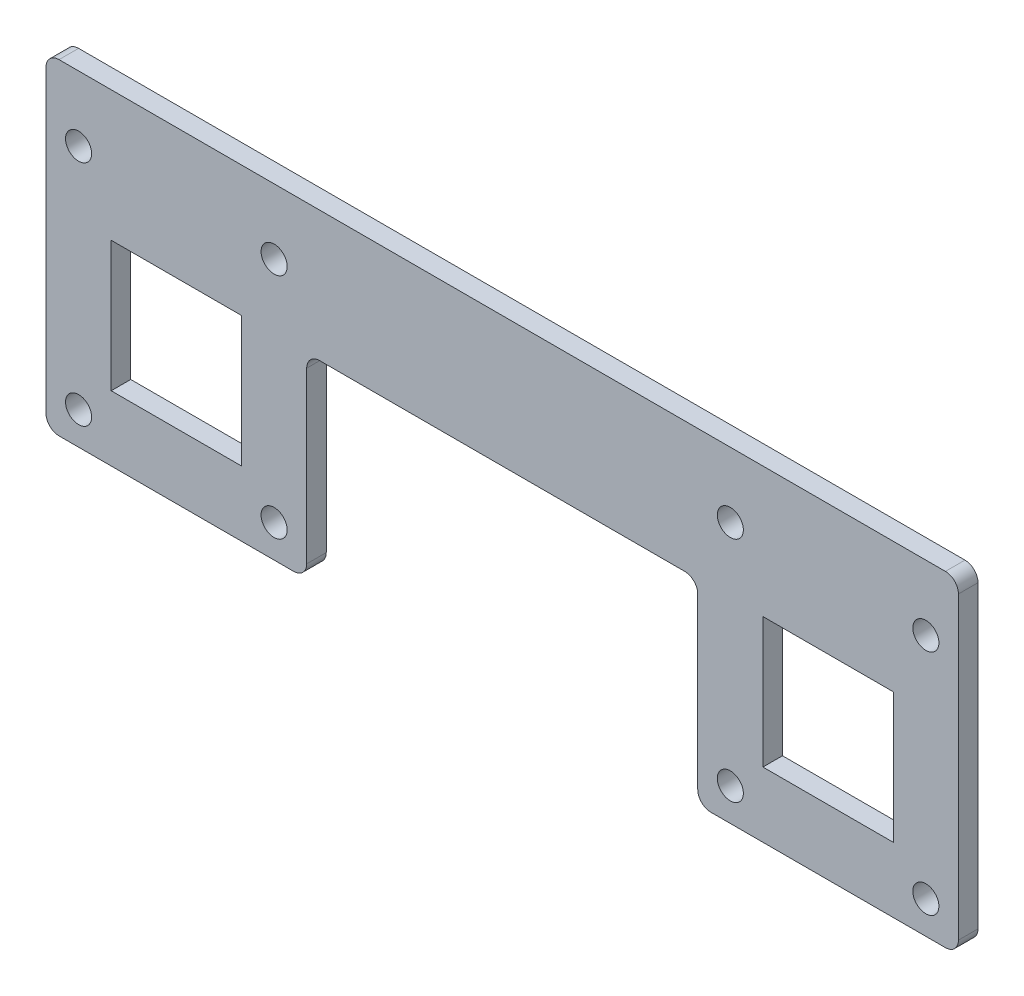
ISO-10303-21;
HEADER;
FILE_DESCRIPTION(('STEP AP214'),'2;1');
FILE_NAME('part.step','',(''),(''),'','','');
FILE_SCHEMA(('AUTOMOTIVE_DESIGN { 1 0 10303 214 1 1 1 1 }'));
ENDSEC;
DATA;
#1=APPLICATION_CONTEXT('core data for automotive mechanical design processes');
#2=APPLICATION_PROTOCOL_DEFINITION('international standard','automotive_design',2000,#1);
#3=PRODUCT_CONTEXT('',#1,'mechanical');
#4=PRODUCT('Part','Part','',(#3));
#5=PRODUCT_RELATED_PRODUCT_CATEGORY('part','',(#4));
#6=PRODUCT_DEFINITION_FORMATION('','',#4);
#7=PRODUCT_DEFINITION_CONTEXT('part definition',#1,'design');
#8=PRODUCT_DEFINITION('design','',#6,#7);
#9=PRODUCT_DEFINITION_SHAPE('','',#8);
#10=(LENGTH_UNIT() NAMED_UNIT(*) SI_UNIT(.MILLI.,.METRE.));
#11=(NAMED_UNIT(*) PLANE_ANGLE_UNIT() SI_UNIT($,.RADIAN.));
#12=(NAMED_UNIT(*) SI_UNIT($,.STERADIAN.) SOLID_ANGLE_UNIT());
#13=UNCERTAINTY_MEASURE_WITH_UNIT(LENGTH_MEASURE(1.E-05),#10,'distance_accuracy_value','');
#14=(GEOMETRIC_REPRESENTATION_CONTEXT(3) GLOBAL_UNCERTAINTY_ASSIGNED_CONTEXT((#13)) GLOBAL_UNIT_ASSIGNED_CONTEXT((#10,
#11,#12)) REPRESENTATION_CONTEXT('',''));
#15=CARTESIAN_POINT('',(0.,0.,0.));
#16=DIRECTION('',(0.,0.,1.));
#17=DIRECTION('',(1.,0.,0.));
#18=AXIS2_PLACEMENT_3D('',#15,#16,#17);
#19=CARTESIAN_POINT('',(-70.,-25.,3.));
#20=DIRECTION('',(0.,1.,0.));
#21=DIRECTION('',(0.,0.,1.));
#22=AXIS2_PLACEMENT_3D('',#19,#20,#21);
#23=PLANE('',#22);
#24=DIRECTION('',(1.,0.,0.));
#25=VECTOR('',#24,1.);
#26=CARTESIAN_POINT('',(-70.,-25.,0.));
#27=LINE('',#26,#25);
#28=CARTESIAN_POINT('',(32.,-25.,0.));
#29=VERTEX_POINT('',#28);
#30=CARTESIAN_POINT('',(68.,-25.,0.));
#31=VERTEX_POINT('',#30);
#32=EDGE_CURVE('E335',#29,#31,#27,.T.);
#33=ORIENTED_EDGE('',*,*,#32,.T.);
#34=DIRECTION('',(0.,0.,-1.));
#35=VECTOR('',#34,1.);
#36=CARTESIAN_POINT('',(68.,-25.,3.));
#37=LINE('',#36,#35);
#38=CARTESIAN_POINT('',(68.,-25.,3.));
#39=VERTEX_POINT('',#38);
#40=EDGE_CURVE('E391',#31,#39,#37,.F.);
#41=ORIENTED_EDGE('',*,*,#40,.T.);
#42=DIRECTION('',(1.,0.,0.));
#43=VECTOR('',#42,1.);
#44=CARTESIAN_POINT('',(-70.,-25.,3.));
#45=LINE('',#44,#43);
#46=CARTESIAN_POINT('',(32.,-25.,3.));
#47=VERTEX_POINT('',#46);
#48=EDGE_CURVE('E318',#47,#39,#45,.T.);
#49=ORIENTED_EDGE('',*,*,#48,.F.);
#50=DIRECTION('',(0.,0.,1.));
#51=VECTOR('',#50,1.);
#52=CARTESIAN_POINT('',(32.,-25.,3.));
#53=LINE('',#52,#51);
#54=EDGE_CURVE('E388',#47,#29,#53,.F.);
#55=ORIENTED_EDGE('',*,*,#54,.T.);
#56=EDGE_LOOP('',(#33,#41,#49,#55));
#57=FACE_BOUND('',#56,.T.);
#58=ADVANCED_FACE('F39',(#57),#23,.F.);
#59=CARTESIAN_POINT('',(70.,25.,3.));
#60=DIRECTION('',(-1.,0.,0.));
#61=DIRECTION('',(0.,0.,1.));
#62=AXIS2_PLACEMENT_3D('',#59,#60,#61);
#63=PLANE('',#62);
#64=DIRECTION('',(0.,1.,0.));
#65=VECTOR('',#64,1.);
#66=CARTESIAN_POINT('',(70.,25.,0.));
#67=LINE('',#66,#65);
#68=CARTESIAN_POINT('',(70.,-23.,0.));
#69=VERTEX_POINT('',#68);
#70=CARTESIAN_POINT('',(70.,23.,0.));
#71=VERTEX_POINT('',#70);
#72=EDGE_CURVE('E255',#69,#71,#67,.T.);
#73=ORIENTED_EDGE('',*,*,#72,.T.);
#74=DIRECTION('',(0.,0.,-1.));
#75=VECTOR('',#74,1.);
#76=CARTESIAN_POINT('',(70.,23.,3.));
#77=LINE('',#76,#75);
#78=CARTESIAN_POINT('',(70.,23.,3.));
#79=VERTEX_POINT('',#78);
#80=EDGE_CURVE('E367',#71,#79,#77,.F.);
#81=ORIENTED_EDGE('',*,*,#80,.T.);
#82=DIRECTION('',(0.,1.,0.));
#83=VECTOR('',#82,1.);
#84=CARTESIAN_POINT('',(70.,25.,3.));
#85=LINE('',#84,#83);
#86=CARTESIAN_POINT('',(70.,-23.,3.));
#87=VERTEX_POINT('',#86);
#88=EDGE_CURVE('E305',#87,#79,#85,.T.);
#89=ORIENTED_EDGE('',*,*,#88,.F.);
#90=DIRECTION('',(0.,0.,-1.));
#91=VECTOR('',#90,1.);
#92=CARTESIAN_POINT('',(70.,-23.,3.));
#93=LINE('',#92,#91);
#94=EDGE_CURVE('E363',#87,#69,#93,.T.);
#95=ORIENTED_EDGE('',*,*,#94,.T.);
#96=EDGE_LOOP('',(#73,#81,#89,#95));
#97=FACE_BOUND('',#96,.T.);
#98=ADVANCED_FACE('F454',(#97),#63,.F.);
#99=CARTESIAN_POINT('',(-70.,25.,3.));
#100=DIRECTION('',(0.,-1.,0.));
#101=DIRECTION('',(0.,0.,-1.));
#102=AXIS2_PLACEMENT_3D('',#99,#100,#101);
#103=PLANE('',#102);
#104=DIRECTION('',(-1.,0.,0.));
#105=VECTOR('',#104,1.);
#106=CARTESIAN_POINT('',(-70.,25.,3.));
#107=LINE('',#106,#105);
#108=CARTESIAN_POINT('',(68.,25.,3.));
#109=VERTEX_POINT('',#108);
#110=CARTESIAN_POINT('',(-68.,25.,3.));
#111=VERTEX_POINT('',#110);
#112=EDGE_CURVE('E309',#109,#111,#107,.T.);
#113=ORIENTED_EDGE('',*,*,#112,.F.);
#114=DIRECTION('',(0.,0.,-1.));
#115=VECTOR('',#114,1.);
#116=CARTESIAN_POINT('',(68.,25.,3.));
#117=LINE('',#116,#115);
#118=CARTESIAN_POINT('',(68.,25.,0.));
#119=VERTEX_POINT('',#118);
#120=EDGE_CURVE('E341',#109,#119,#117,.T.);
#121=ORIENTED_EDGE('',*,*,#120,.T.);
#122=DIRECTION('',(-1.,0.,0.));
#123=VECTOR('',#122,1.);
#124=CARTESIAN_POINT('',(-70.,25.,0.));
#125=LINE('',#124,#123);
#126=CARTESIAN_POINT('',(-68.,25.,0.));
#127=VERTEX_POINT('',#126);
#128=EDGE_CURVE('E327',#119,#127,#125,.T.);
#129=ORIENTED_EDGE('',*,*,#128,.T.);
#130=DIRECTION('',(0.,0.,-1.));
#131=VECTOR('',#130,1.);
#132=CARTESIAN_POINT('',(-68.,25.,3.));
#133=LINE('',#132,#131);
#134=EDGE_CURVE('E323',#127,#111,#133,.F.);
#135=ORIENTED_EDGE('',*,*,#134,.T.);
#136=EDGE_LOOP('',(#113,#121,#129,#135));
#137=FACE_BOUND('',#136,.T.);
#138=ADVANCED_FACE('F463',(#137),#103,.F.);
#139=CARTESIAN_POINT('',(-70.,25.,3.));
#140=DIRECTION('',(1.,0.,0.));
#141=DIRECTION('',(0.,1.,0.));
#142=AXIS2_PLACEMENT_3D('',#139,#140,#141);
#143=PLANE('',#142);
#144=DIRECTION('',(0.,-1.,0.));
#145=VECTOR('',#144,1.);
#146=CARTESIAN_POINT('',(-70.,25.,0.));
#147=LINE('',#146,#145);
#148=CARTESIAN_POINT('',(-70.,23.,0.));
#149=VERTEX_POINT('',#148);
#150=CARTESIAN_POINT('',(-70.,-23.,0.));
#151=VERTEX_POINT('',#150);
#152=EDGE_CURVE('E331',#149,#151,#147,.T.);
#153=ORIENTED_EDGE('',*,*,#152,.T.);
#154=DIRECTION('',(0.,0.,-1.));
#155=VECTOR('',#154,1.);
#156=CARTESIAN_POINT('',(-70.,-23.,3.));
#157=LINE('',#156,#155);
#158=CARTESIAN_POINT('',(-70.,-23.,3.));
#159=VERTEX_POINT('',#158);
#160=EDGE_CURVE('E426',#151,#159,#157,.F.);
#161=ORIENTED_EDGE('',*,*,#160,.T.);
#162=DIRECTION('',(0.,-1.,0.));
#163=VECTOR('',#162,1.);
#164=CARTESIAN_POINT('',(-70.,25.,3.));
#165=LINE('',#164,#163);
#166=CARTESIAN_POINT('',(-70.,23.,3.));
#167=VERTEX_POINT('',#166);
#168=EDGE_CURVE('E314',#167,#159,#165,.T.);
#169=ORIENTED_EDGE('',*,*,#168,.F.);
#170=DIRECTION('',(0.,0.,-1.));
#171=VECTOR('',#170,1.);
#172=CARTESIAN_POINT('',(-70.,23.,3.));
#173=LINE('',#172,#171);
#174=EDGE_CURVE('E422',#167,#149,#173,.T.);
#175=ORIENTED_EDGE('',*,*,#174,.T.);
#176=EDGE_LOOP('',(#153,#161,#169,#175));
#177=FACE_BOUND('',#176,.T.);
#178=ADVANCED_FACE('F471',(#177),#143,.F.);
#179=CARTESIAN_POINT('',(-68.,-25.,0.));
#180=VERTEX_POINT('',#179);
#181=CARTESIAN_POINT('',(-32.,-25.,0.));
#182=VERTEX_POINT('',#181);
#183=EDGE_CURVE('E310',#180,#182,#27,.T.);
#184=ORIENTED_EDGE('',*,*,#183,.T.);
#185=DIRECTION('',(0.,0.,1.));
#186=VECTOR('',#185,1.);
#187=CARTESIAN_POINT('',(-32.,-25.,3.));
#188=LINE('',#187,#186);
#189=CARTESIAN_POINT('',(-32.,-25.,3.));
#190=VERTEX_POINT('',#189);
#191=EDGE_CURVE('E418',#182,#190,#188,.T.);
#192=ORIENTED_EDGE('',*,*,#191,.T.);
#193=CARTESIAN_POINT('',(-68.,-25.,3.));
#194=VERTEX_POINT('',#193);
#195=EDGE_CURVE('E319',#194,#190,#45,.T.);
#196=ORIENTED_EDGE('',*,*,#195,.F.);
#197=DIRECTION('',(0.,0.,-1.));
#198=VECTOR('',#197,1.);
#199=CARTESIAN_POINT('',(-68.,-25.,3.));
#200=LINE('',#199,#198);
#201=EDGE_CURVE('E414',#194,#180,#200,.T.);
#202=ORIENTED_EDGE('',*,*,#201,.T.);
#203=EDGE_LOOP('',(#184,#192,#196,#202));
#204=FACE_BOUND('',#203,.T.);
#205=ADVANCED_FACE('F479',(#204),#23,.F.);
#206=CARTESIAN_POINT('',(0.,0.,3.));
#207=DIRECTION('',(0.,0.,1.));
#208=DIRECTION('',(1.,0.,0.));
#209=AXIS2_PLACEMENT_3D('',#206,#207,#208);
#210=PLANE('',#209);
#211=CARTESIAN_POINT('',(-65.,15.,3.));
#212=DIRECTION('',(0.,0.,1.));
#213=DIRECTION('',(1.,0.,0.));
#214=AXIS2_PLACEMENT_3D('',#211,#212,#213);
#215=CIRCLE('',#214,2.);
#216=CARTESIAN_POINT('',(-63.,15.,3.));
#217=VERTEX_POINT('',#216);
#218=EDGE_CURVE('E569',#217,#217,#215,.T.);
#219=ORIENTED_EDGE('',*,*,#218,.F.);
#220=EDGE_LOOP('',(#219));
#221=FACE_BOUND('',#220,.T.);
#222=CARTESIAN_POINT('',(-35.,15.,3.));
#223=DIRECTION('',(0.,0.,1.));
#224=DIRECTION('',(1.,0.,0.));
#225=AXIS2_PLACEMENT_3D('',#222,#223,#224);
#226=CIRCLE('',#225,2.);
#227=CARTESIAN_POINT('',(-33.,15.,3.));
#228=VERTEX_POINT('',#227);
#229=EDGE_CURVE('E561',#228,#228,#226,.T.);
#230=ORIENTED_EDGE('',*,*,#229,.F.);
#231=EDGE_LOOP('',(#230));
#232=FACE_BOUND('',#231,.T.);
#233=CARTESIAN_POINT('',(35.,15.,3.));
#234=DIRECTION('',(0.,0.,1.));
#235=DIRECTION('',(-1.,0.,0.));
#236=AXIS2_PLACEMENT_3D('',#233,#234,#235);
#237=CIRCLE('',#236,2.);
#238=CARTESIAN_POINT('',(33.,15.,3.));
#239=VERTEX_POINT('',#238);
#240=EDGE_CURVE('E553',#239,#239,#237,.T.);
#241=ORIENTED_EDGE('',*,*,#240,.F.);
#242=EDGE_LOOP('',(#241));
#243=FACE_BOUND('',#242,.T.);
#244=CARTESIAN_POINT('',(65.,15.,3.));
#245=DIRECTION('',(0.,0.,1.));
#246=DIRECTION('',(-1.,0.,0.));
#247=AXIS2_PLACEMENT_3D('',#244,#245,#246);
#248=CIRCLE('',#247,2.);
#249=CARTESIAN_POINT('',(63.,15.,3.));
#250=VERTEX_POINT('',#249);
#251=EDGE_CURVE('E545',#250,#250,#248,.T.);
#252=ORIENTED_EDGE('',*,*,#251,.F.);
#253=EDGE_LOOP('',(#252));
#254=FACE_BOUND('',#253,.T.);
#255=CARTESIAN_POINT('',(-65.,-20.,3.));
#256=DIRECTION('',(0.,0.,1.));
#257=DIRECTION('',(1.,0.,0.));
#258=AXIS2_PLACEMENT_3D('',#255,#256,#257);
#259=CIRCLE('',#258,2.);
#260=CARTESIAN_POINT('',(-63.,-20.,3.));
#261=VERTEX_POINT('',#260);
#262=EDGE_CURVE('E530',#261,#261,#259,.T.);
#263=ORIENTED_EDGE('',*,*,#262,.F.);
#264=EDGE_LOOP('',(#263));
#265=FACE_BOUND('',#264,.T.);
#266=CARTESIAN_POINT('',(35.,-20.,3.));
#267=DIRECTION('',(0.,0.,1.));
#268=DIRECTION('',(-1.,0.,0.));
#269=AXIS2_PLACEMENT_3D('',#266,#267,#268);
#270=CIRCLE('',#269,2.);
#271=CARTESIAN_POINT('',(33.,-20.,3.));
#272=VERTEX_POINT('',#271);
#273=EDGE_CURVE('E531',#272,#272,#270,.T.);
#274=ORIENTED_EDGE('',*,*,#273,.F.);
#275=EDGE_LOOP('',(#274));
#276=FACE_BOUND('',#275,.T.);
#277=CARTESIAN_POINT('',(65.,-20.,3.));
#278=DIRECTION('',(0.,0.,1.));
#279=DIRECTION('',(-1.,0.,0.));
#280=AXIS2_PLACEMENT_3D('',#277,#278,#279);
#281=CIRCLE('',#280,2.);
#282=CARTESIAN_POINT('',(63.,-20.,3.));
#283=VERTEX_POINT('',#282);
#284=EDGE_CURVE('E513',#283,#283,#281,.T.);
#285=ORIENTED_EDGE('',*,*,#284,.F.);
#286=EDGE_LOOP('',(#285));
#287=FACE_BOUND('',#286,.T.);
#288=CARTESIAN_POINT('',(-35.,-20.,3.));
#289=DIRECTION('',(0.,0.,1.));
#290=DIRECTION('',(1.,0.,0.));
#291=AXIS2_PLACEMENT_3D('',#288,#289,#290);
#292=CIRCLE('',#291,2.);
#293=CARTESIAN_POINT('',(-33.,-20.,3.));
#294=VERTEX_POINT('',#293);
#295=EDGE_CURVE('E522',#294,#294,#292,.T.);
#296=ORIENTED_EDGE('',*,*,#295,.F.);
#297=EDGE_LOOP('',(#296));
#298=FACE_BOUND('',#297,.T.);
#299=ORIENTED_EDGE('',*,*,#88,.T.);
#300=CARTESIAN_POINT('',(68.,23.,3.));
#301=DIRECTION('',(0.,0.,1.));
#302=DIRECTION('',(1.,0.,0.));
#303=AXIS2_PLACEMENT_3D('',#300,#301,#302);
#304=CIRCLE('',#303,2.);
#305=EDGE_CURVE('E385',#79,#109,#304,.T.);
#306=ORIENTED_EDGE('',*,*,#305,.T.);
#307=ORIENTED_EDGE('',*,*,#112,.T.);
#308=CARTESIAN_POINT('',(-68.,23.,3.));
#309=DIRECTION('',(0.,0.,1.));
#310=DIRECTION('',(1.,0.,0.));
#311=AXIS2_PLACEMENT_3D('',#308,#309,#310);
#312=CIRCLE('',#311,2.);
#313=EDGE_CURVE('E370',#111,#167,#312,.T.);
#314=ORIENTED_EDGE('',*,*,#313,.T.);
#315=ORIENTED_EDGE('',*,*,#168,.T.);
#316=CARTESIAN_POINT('',(-68.,-23.,3.));
#317=DIRECTION('',(0.,0.,1.));
#318=DIRECTION('',(1.,0.,0.));
#319=AXIS2_PLACEMENT_3D('',#316,#317,#318);
#320=CIRCLE('',#319,2.);
#321=EDGE_CURVE('E373',#159,#194,#320,.T.);
#322=ORIENTED_EDGE('',*,*,#321,.T.);
#323=ORIENTED_EDGE('',*,*,#195,.T.);
#324=CARTESIAN_POINT('',(-32.,-23.,3.));
#325=DIRECTION('',(0.,0.,1.));
#326=DIRECTION('',(1.,0.,0.));
#327=AXIS2_PLACEMENT_3D('',#324,#325,#326);
#328=CIRCLE('',#327,2.);
#329=CARTESIAN_POINT('',(-30.,-23.,3.));
#330=VERTEX_POINT('',#329);
#331=EDGE_CURVE('E376',#190,#330,#328,.T.);
#332=ORIENTED_EDGE('',*,*,#331,.T.);
#333=DIRECTION('',(0.,-1.,0.));
#334=VECTOR('',#333,1.);
#335=CARTESIAN_POINT('',(-30.,5.,3.));
#336=LINE('',#335,#334);
#337=CARTESIAN_POINT('',(-30.,3.,3.));
#338=VERTEX_POINT('',#337);
#339=EDGE_CURVE('E236',#338,#330,#336,.T.);
#340=ORIENTED_EDGE('',*,*,#339,.F.);
#341=CARTESIAN_POINT('',(-28.,3.,3.));
#342=DIRECTION('',(0.,0.,1.));
#343=DIRECTION('',(1.,0.,0.));
#344=AXIS2_PLACEMENT_3D('',#341,#342,#343);
#345=CIRCLE('',#344,2.);
#346=CARTESIAN_POINT('',(-28.,5.,3.));
#347=VERTEX_POINT('',#346);
#348=EDGE_CURVE('E48',#338,#347,#345,.F.);
#349=ORIENTED_EDGE('',*,*,#348,.T.);
#350=DIRECTION('',(-1.,0.,0.));
#351=VECTOR('',#350,1.);
#352=CARTESIAN_POINT('',(-30.,5.,3.));
#353=LINE('',#352,#351);
#354=CARTESIAN_POINT('',(28.,5.,3.));
#355=VERTEX_POINT('',#354);
#356=EDGE_CURVE('E494',#355,#347,#353,.T.);
#357=ORIENTED_EDGE('',*,*,#356,.F.);
#358=CARTESIAN_POINT('',(28.,3.,3.));
#359=DIRECTION('',(0.,0.,1.));
#360=DIRECTION('',(1.,0.,0.));
#361=AXIS2_PLACEMENT_3D('',#358,#359,#360);
#362=CIRCLE('',#361,2.);
#363=CARTESIAN_POINT('',(30.,3.,3.));
#364=VERTEX_POINT('',#363);
#365=EDGE_CURVE('E62',#355,#364,#362,.F.);
#366=ORIENTED_EDGE('',*,*,#365,.T.);
#367=DIRECTION('',(0.,1.,0.));
#368=VECTOR('',#367,1.);
#369=CARTESIAN_POINT('',(30.,5.,3.));
#370=LINE('',#369,#368);
#371=CARTESIAN_POINT('',(30.,-23.,3.));
#372=VERTEX_POINT('',#371);
#373=EDGE_CURVE('E500',#372,#364,#370,.T.);
#374=ORIENTED_EDGE('',*,*,#373,.F.);
#375=CARTESIAN_POINT('',(32.,-23.,3.));
#376=DIRECTION('',(0.,0.,1.));
#377=DIRECTION('',(1.,0.,0.));
#378=AXIS2_PLACEMENT_3D('',#375,#376,#377);
#379=CIRCLE('',#378,2.);
#380=EDGE_CURVE('E379',#372,#47,#379,.T.);
#381=ORIENTED_EDGE('',*,*,#380,.T.);
#382=ORIENTED_EDGE('',*,*,#48,.T.);
#383=CARTESIAN_POINT('',(68.,-23.,3.));
#384=DIRECTION('',(0.,0.,1.));
#385=DIRECTION('',(1.,0.,0.));
#386=AXIS2_PLACEMENT_3D('',#383,#384,#385);
#387=CIRCLE('',#386,2.);
#388=EDGE_CURVE('E382',#39,#87,#387,.T.);
#389=ORIENTED_EDGE('',*,*,#388,.T.);
#390=EDGE_LOOP('',(#299,#306,#307,#314,#315,#322,#323,#332,#340,#349,#357,#366,#374,#381,#382,#389));
#391=FACE_BOUND('',#390,.T.);
#392=DIRECTION('',(0.,1.,0.));
#393=VECTOR('',#392,1.);
#394=CARTESIAN_POINT('',(-40.,5.,3.));
#395=LINE('',#394,#393);
#396=CARTESIAN_POINT('',(-40.,-15.,3.));
#397=VERTEX_POINT('',#396);
#398=CARTESIAN_POINT('',(-40.,5.,3.));
#399=VERTEX_POINT('',#398);
#400=EDGE_CURVE('E208',#397,#399,#395,.T.);
#401=ORIENTED_EDGE('',*,*,#400,.F.);
#402=DIRECTION('',(1.,0.,0.));
#403=VECTOR('',#402,1.);
#404=CARTESIAN_POINT('',(-60.,-15.,3.));
#405=LINE('',#404,#403);
#406=CARTESIAN_POINT('',(-60.,-15.,3.));
#407=VERTEX_POINT('',#406);
#408=EDGE_CURVE('E229',#407,#397,#405,.T.);
#409=ORIENTED_EDGE('',*,*,#408,.F.);
#410=DIRECTION('',(0.,-1.,0.));
#411=VECTOR('',#410,1.);
#412=CARTESIAN_POINT('',(-60.,5.,3.));
#413=LINE('',#412,#411);
#414=CARTESIAN_POINT('',(-60.,5.,3.));
#415=VERTEX_POINT('',#414);
#416=EDGE_CURVE('E233',#415,#407,#413,.T.);
#417=ORIENTED_EDGE('',*,*,#416,.F.);
#418=DIRECTION('',(-1.,0.,0.));
#419=VECTOR('',#418,1.);
#420=CARTESIAN_POINT('',(-60.,5.,3.));
#421=LINE('',#420,#419);
#422=EDGE_CURVE('E245',#399,#415,#421,.T.);
#423=ORIENTED_EDGE('',*,*,#422,.F.);
#424=EDGE_LOOP('',(#401,#409,#417,#423));
#425=FACE_BOUND('',#424,.T.);
#426=DIRECTION('',(0.,1.,0.));
#427=VECTOR('',#426,1.);
#428=CARTESIAN_POINT('',(60.,5.,3.));
#429=LINE('',#428,#427);
#430=CARTESIAN_POINT('',(60.,-15.,3.));
#431=VERTEX_POINT('',#430);
#432=CARTESIAN_POINT('',(60.,5.,3.));
#433=VERTEX_POINT('',#432);
#434=EDGE_CURVE('E279',#431,#433,#429,.T.);
#435=ORIENTED_EDGE('',*,*,#434,.F.);
#436=DIRECTION('',(1.,0.,0.));
#437=VECTOR('',#436,1.);
#438=CARTESIAN_POINT('',(60.,-15.,3.));
#439=LINE('',#438,#437);
#440=CARTESIAN_POINT('',(40.,-15.,3.));
#441=VERTEX_POINT('',#440);
#442=EDGE_CURVE('E266',#441,#431,#439,.T.);
#443=ORIENTED_EDGE('',*,*,#442,.F.);
#444=DIRECTION('',(0.,-1.,0.));
#445=VECTOR('',#444,1.);
#446=CARTESIAN_POINT('',(40.,5.,3.));
#447=LINE('',#446,#445);
#448=CARTESIAN_POINT('',(40.,5.,3.));
#449=VERTEX_POINT('',#448);
#450=EDGE_CURVE('E287',#449,#441,#447,.T.);
#451=ORIENTED_EDGE('',*,*,#450,.F.);
#452=DIRECTION('',(-1.,0.,0.));
#453=VECTOR('',#452,1.);
#454=CARTESIAN_POINT('',(60.,5.,3.));
#455=LINE('',#454,#453);
#456=EDGE_CURVE('E282',#433,#449,#455,.T.);
#457=ORIENTED_EDGE('',*,*,#456,.F.);
#458=EDGE_LOOP('',(#435,#443,#451,#457));
#459=FACE_BOUND('',#458,.T.);
#460=ADVANCED_FACE('F450',(#221,#232,#243,#254,#265,#276,#287,#298,#391,#425,#459),#210,.T.);
#461=CARTESIAN_POINT('',(0.,0.,0.));
#462=DIRECTION('',(0.,0.,1.));
#463=DIRECTION('',(1.,0.,0.));
#464=AXIS2_PLACEMENT_3D('',#461,#462,#463);
#465=PLANE('',#464);
#466=CARTESIAN_POINT('',(-65.,15.,0.));
#467=DIRECTION('',(0.,0.,1.));
#468=DIRECTION('',(1.,0.,0.));
#469=AXIS2_PLACEMENT_3D('',#466,#467,#468);
#470=CIRCLE('',#469,2.);
#471=CARTESIAN_POINT('',(-63.,15.,0.));
#472=VERTEX_POINT('',#471);
#473=EDGE_CURVE('E535',#472,#472,#470,.T.);
#474=ORIENTED_EDGE('',*,*,#473,.T.);
#475=EDGE_LOOP('',(#474));
#476=FACE_BOUND('',#475,.T.);
#477=CARTESIAN_POINT('',(-35.,15.,0.));
#478=DIRECTION('',(0.,0.,1.));
#479=DIRECTION('',(1.,0.,0.));
#480=AXIS2_PLACEMENT_3D('',#477,#478,#479);
#481=CIRCLE('',#480,2.);
#482=CARTESIAN_POINT('',(-33.,15.,0.));
#483=VERTEX_POINT('',#482);
#484=EDGE_CURVE('E565',#483,#483,#481,.T.);
#485=ORIENTED_EDGE('',*,*,#484,.T.);
#486=EDGE_LOOP('',(#485));
#487=FACE_BOUND('',#486,.T.);
#488=CARTESIAN_POINT('',(35.,15.,0.));
#489=DIRECTION('',(0.,0.,1.));
#490=DIRECTION('',(-1.,0.,0.));
#491=AXIS2_PLACEMENT_3D('',#488,#489,#490);
#492=CIRCLE('',#491,2.);
#493=CARTESIAN_POINT('',(33.,15.,0.));
#494=VERTEX_POINT('',#493);
#495=EDGE_CURVE('E557',#494,#494,#492,.T.);
#496=ORIENTED_EDGE('',*,*,#495,.T.);
#497=EDGE_LOOP('',(#496));
#498=FACE_BOUND('',#497,.T.);
#499=CARTESIAN_POINT('',(65.,15.,0.));
#500=DIRECTION('',(0.,0.,1.));
#501=DIRECTION('',(-1.,0.,0.));
#502=AXIS2_PLACEMENT_3D('',#499,#500,#501);
#503=CIRCLE('',#502,2.);
#504=CARTESIAN_POINT('',(63.,15.,0.));
#505=VERTEX_POINT('',#504);
#506=EDGE_CURVE('E549',#505,#505,#503,.T.);
#507=ORIENTED_EDGE('',*,*,#506,.T.);
#508=EDGE_LOOP('',(#507));
#509=FACE_BOUND('',#508,.T.);
#510=CARTESIAN_POINT('',(-65.,-20.,0.));
#511=DIRECTION('',(0.,0.,1.));
#512=DIRECTION('',(1.,0.,0.));
#513=AXIS2_PLACEMENT_3D('',#510,#511,#512);
#514=CIRCLE('',#513,2.);
#515=CARTESIAN_POINT('',(-63.,-20.,0.));
#516=VERTEX_POINT('',#515);
#517=EDGE_CURVE('E505',#516,#516,#514,.T.);
#518=ORIENTED_EDGE('',*,*,#517,.T.);
#519=EDGE_LOOP('',(#518));
#520=FACE_BOUND('',#519,.T.);
#521=CARTESIAN_POINT('',(35.,-20.,0.));
#522=DIRECTION('',(0.,0.,1.));
#523=DIRECTION('',(-1.,0.,0.));
#524=AXIS2_PLACEMENT_3D('',#521,#522,#523);
#525=CIRCLE('',#524,2.);
#526=CARTESIAN_POINT('',(33.,-20.,0.));
#527=VERTEX_POINT('',#526);
#528=EDGE_CURVE('E518',#527,#527,#525,.T.);
#529=ORIENTED_EDGE('',*,*,#528,.T.);
#530=EDGE_LOOP('',(#529));
#531=FACE_BOUND('',#530,.T.);
#532=CARTESIAN_POINT('',(65.,-20.,0.));
#533=DIRECTION('',(0.,0.,1.));
#534=DIRECTION('',(-1.,0.,0.));
#535=AXIS2_PLACEMENT_3D('',#532,#533,#534);
#536=CIRCLE('',#535,2.);
#537=CARTESIAN_POINT('',(63.,-20.,0.));
#538=VERTEX_POINT('',#537);
#539=EDGE_CURVE('E517',#538,#538,#536,.T.);
#540=ORIENTED_EDGE('',*,*,#539,.T.);
#541=EDGE_LOOP('',(#540));
#542=FACE_BOUND('',#541,.T.);
#543=CARTESIAN_POINT('',(-35.,-20.,0.));
#544=DIRECTION('',(0.,0.,1.));
#545=DIRECTION('',(1.,0.,0.));
#546=AXIS2_PLACEMENT_3D('',#543,#544,#545);
#547=CIRCLE('',#546,2.);
#548=CARTESIAN_POINT('',(-33.,-20.,0.));
#549=VERTEX_POINT('',#548);
#550=EDGE_CURVE('E526',#549,#549,#547,.T.);
#551=ORIENTED_EDGE('',*,*,#550,.T.);
#552=EDGE_LOOP('',(#551));
#553=FACE_BOUND('',#552,.T.);
#554=ORIENTED_EDGE('',*,*,#128,.F.);
#555=CARTESIAN_POINT('',(68.,23.,0.));
#556=DIRECTION('',(0.,0.,1.));
#557=DIRECTION('',(1.,0.,0.));
#558=AXIS2_PLACEMENT_3D('',#555,#556,#557);
#559=CIRCLE('',#558,2.);
#560=EDGE_CURVE('E360',#119,#71,#559,.F.);
#561=ORIENTED_EDGE('',*,*,#560,.T.);
#562=ORIENTED_EDGE('',*,*,#72,.F.);
#563=CARTESIAN_POINT('',(68.,-23.,0.));
#564=DIRECTION('',(0.,0.,1.));
#565=DIRECTION('',(1.,0.,0.));
#566=AXIS2_PLACEMENT_3D('',#563,#564,#565);
#567=CIRCLE('',#566,2.);
#568=EDGE_CURVE('E357',#69,#31,#567,.F.);
#569=ORIENTED_EDGE('',*,*,#568,.T.);
#570=ORIENTED_EDGE('',*,*,#32,.F.);
#571=CARTESIAN_POINT('',(32.,-23.,0.));
#572=DIRECTION('',(0.,0.,1.));
#573=DIRECTION('',(1.,0.,0.));
#574=AXIS2_PLACEMENT_3D('',#571,#572,#573);
#575=CIRCLE('',#574,2.);
#576=CARTESIAN_POINT('',(30.,-23.,0.));
#577=VERTEX_POINT('',#576);
#578=EDGE_CURVE('E354',#29,#577,#575,.F.);
#579=ORIENTED_EDGE('',*,*,#578,.T.);
#580=DIRECTION('',(0.,1.,0.));
#581=VECTOR('',#580,1.);
#582=CARTESIAN_POINT('',(30.,5.,0.));
#583=LINE('',#582,#581);
#584=CARTESIAN_POINT('',(30.,3.,0.));
#585=VERTEX_POINT('',#584);
#586=EDGE_CURVE('E493',#577,#585,#583,.T.);
#587=ORIENTED_EDGE('',*,*,#586,.T.);
#588=CARTESIAN_POINT('',(28.,3.,0.));
#589=DIRECTION('',(0.,0.,1.));
#590=DIRECTION('',(1.,0.,0.));
#591=AXIS2_PLACEMENT_3D('',#588,#589,#590);
#592=CIRCLE('',#591,2.);
#593=CARTESIAN_POINT('',(28.,5.,0.));
#594=VERTEX_POINT('',#593);
#595=EDGE_CURVE('E431',#585,#594,#592,.T.);
#596=ORIENTED_EDGE('',*,*,#595,.T.);
#597=DIRECTION('',(-1.,0.,0.));
#598=VECTOR('',#597,1.);
#599=CARTESIAN_POINT('',(-30.,5.,0.));
#600=LINE('',#599,#598);
#601=CARTESIAN_POINT('',(-28.,5.,0.));
#602=VERTEX_POINT('',#601);
#603=EDGE_CURVE('E498',#594,#602,#600,.T.);
#604=ORIENTED_EDGE('',*,*,#603,.T.);
#605=CARTESIAN_POINT('',(-28.,3.,0.));
#606=DIRECTION('',(0.,0.,1.));
#607=DIRECTION('',(1.,0.,0.));
#608=AXIS2_PLACEMENT_3D('',#605,#606,#607);
#609=CIRCLE('',#608,2.);
#610=CARTESIAN_POINT('',(-30.,3.,0.));
#611=VERTEX_POINT('',#610);
#612=EDGE_CURVE('E11',#602,#611,#609,.T.);
#613=ORIENTED_EDGE('',*,*,#612,.T.);
#614=DIRECTION('',(0.,-1.,0.));
#615=VECTOR('',#614,1.);
#616=CARTESIAN_POINT('',(-30.,5.,0.));
#617=LINE('',#616,#615);
#618=CARTESIAN_POINT('',(-30.,-23.,0.));
#619=VERTEX_POINT('',#618);
#620=EDGE_CURVE('E283',#611,#619,#617,.T.);
#621=ORIENTED_EDGE('',*,*,#620,.T.);
#622=CARTESIAN_POINT('',(-32.,-23.,0.));
#623=DIRECTION('',(0.,0.,1.));
#624=DIRECTION('',(1.,0.,0.));
#625=AXIS2_PLACEMENT_3D('',#622,#623,#624);
#626=CIRCLE('',#625,2.);
#627=EDGE_CURVE('E351',#619,#182,#626,.F.);
#628=ORIENTED_EDGE('',*,*,#627,.T.);
#629=ORIENTED_EDGE('',*,*,#183,.F.);
#630=CARTESIAN_POINT('',(-68.,-23.,0.));
#631=DIRECTION('',(0.,0.,1.));
#632=DIRECTION('',(1.,0.,0.));
#633=AXIS2_PLACEMENT_3D('',#630,#631,#632);
#634=CIRCLE('',#633,2.);
#635=EDGE_CURVE('E348',#180,#151,#634,.F.);
#636=ORIENTED_EDGE('',*,*,#635,.T.);
#637=ORIENTED_EDGE('',*,*,#152,.F.);
#638=CARTESIAN_POINT('',(-68.,23.,0.));
#639=DIRECTION('',(0.,0.,1.));
#640=DIRECTION('',(1.,0.,0.));
#641=AXIS2_PLACEMENT_3D('',#638,#639,#640);
#642=CIRCLE('',#641,2.);
#643=EDGE_CURVE('E345',#149,#127,#642,.F.);
#644=ORIENTED_EDGE('',*,*,#643,.T.);
#645=EDGE_LOOP('',(#554,#561,#562,#569,#570,#579,#587,#596,#604,#613,#621,#628,#629,#636,#637,#644));
#646=FACE_BOUND('',#645,.T.);
#647=DIRECTION('',(1.,0.,0.));
#648=VECTOR('',#647,1.);
#649=CARTESIAN_POINT('',(-60.,-15.,0.));
#650=LINE('',#649,#648);
#651=CARTESIAN_POINT('',(-60.,-15.,0.));
#652=VERTEX_POINT('',#651);
#653=CARTESIAN_POINT('',(-40.,-15.,0.));
#654=VERTEX_POINT('',#653);
#655=EDGE_CURVE('E214',#652,#654,#650,.T.);
#656=ORIENTED_EDGE('',*,*,#655,.T.);
#657=DIRECTION('',(0.,1.,0.));
#658=VECTOR('',#657,1.);
#659=CARTESIAN_POINT('',(-40.,5.,0.));
#660=LINE('',#659,#658);
#661=CARTESIAN_POINT('',(-40.,5.,0.));
#662=VERTEX_POINT('',#661);
#663=EDGE_CURVE('E205',#654,#662,#660,.T.);
#664=ORIENTED_EDGE('',*,*,#663,.T.);
#665=DIRECTION('',(-1.,0.,0.));
#666=VECTOR('',#665,1.);
#667=CARTESIAN_POINT('',(-60.,5.,0.));
#668=LINE('',#667,#666);
#669=CARTESIAN_POINT('',(-60.,5.,0.));
#670=VERTEX_POINT('',#669);
#671=EDGE_CURVE('E218',#662,#670,#668,.T.);
#672=ORIENTED_EDGE('',*,*,#671,.T.);
#673=DIRECTION('',(0.,-1.,0.));
#674=VECTOR('',#673,1.);
#675=CARTESIAN_POINT('',(-60.,5.,0.));
#676=LINE('',#675,#674);
#677=EDGE_CURVE('E223',#670,#652,#676,.T.);
#678=ORIENTED_EDGE('',*,*,#677,.T.);
#679=EDGE_LOOP('',(#656,#664,#672,#678));
#680=FACE_BOUND('',#679,.T.);
#681=DIRECTION('',(1.,0.,0.));
#682=VECTOR('',#681,1.);
#683=CARTESIAN_POINT('',(60.,-15.,0.));
#684=LINE('',#683,#682);
#685=CARTESIAN_POINT('',(40.,-15.,0.));
#686=VERTEX_POINT('',#685);
#687=CARTESIAN_POINT('',(60.,-15.,0.));
#688=VERTEX_POINT('',#687);
#689=EDGE_CURVE('E274',#686,#688,#684,.T.);
#690=ORIENTED_EDGE('',*,*,#689,.T.);
#691=DIRECTION('',(0.,1.,0.));
#692=VECTOR('',#691,1.);
#693=CARTESIAN_POINT('',(60.,5.,0.));
#694=LINE('',#693,#692);
#695=CARTESIAN_POINT('',(60.,5.,0.));
#696=VERTEX_POINT('',#695);
#697=EDGE_CURVE('E261',#688,#696,#694,.T.);
#698=ORIENTED_EDGE('',*,*,#697,.T.);
#699=DIRECTION('',(-1.,0.,0.));
#700=VECTOR('',#699,1.);
#701=CARTESIAN_POINT('',(60.,5.,0.));
#702=LINE('',#701,#700);
#703=CARTESIAN_POINT('',(40.,5.,0.));
#704=VERTEX_POINT('',#703);
#705=EDGE_CURVE('E265',#696,#704,#702,.T.);
#706=ORIENTED_EDGE('',*,*,#705,.T.);
#707=DIRECTION('',(0.,-1.,0.));
#708=VECTOR('',#707,1.);
#709=CARTESIAN_POINT('',(40.,5.,0.));
#710=LINE('',#709,#708);
#711=EDGE_CURVE('E270',#704,#686,#710,.T.);
#712=ORIENTED_EDGE('',*,*,#711,.T.);
#713=EDGE_LOOP('',(#690,#698,#706,#712));
#714=FACE_BOUND('',#713,.T.);
#715=ADVANCED_FACE('F225',(#476,#487,#498,#509,#520,#531,#542,#553,#646,#680,#714),#465,.F.);
#716=CARTESIAN_POINT('',(60.,5.,0.));
#717=DIRECTION('',(1.,0.,0.));
#718=DIRECTION('',(0.,0.,-1.));
#719=AXIS2_PLACEMENT_3D('',#716,#717,#718);
#720=PLANE('',#719);
#721=ORIENTED_EDGE('',*,*,#434,.T.);
#722=DIRECTION('',(0.,0.,1.));
#723=VECTOR('',#722,1.);
#724=CARTESIAN_POINT('',(60.,5.,0.));
#725=LINE('',#724,#723);
#726=EDGE_CURVE('E278',#696,#433,#725,.T.);
#727=ORIENTED_EDGE('',*,*,#726,.F.);
#728=ORIENTED_EDGE('',*,*,#697,.F.);
#729=DIRECTION('',(0.,0.,1.));
#730=VECTOR('',#729,1.);
#731=CARTESIAN_POINT('',(60.,-15.,0.));
#732=LINE('',#731,#730);
#733=EDGE_CURVE('E246',#688,#431,#732,.T.);
#734=ORIENTED_EDGE('',*,*,#733,.T.);
#735=EDGE_LOOP('',(#721,#727,#728,#734));
#736=FACE_BOUND('',#735,.T.);
#737=ADVANCED_FACE('F735',(#736),#720,.F.);
#738=CARTESIAN_POINT('',(60.,-15.,0.));
#739=DIRECTION('',(0.,-1.,0.));
#740=DIRECTION('',(1.,0.,0.));
#741=AXIS2_PLACEMENT_3D('',#738,#739,#740);
#742=PLANE('',#741);
#743=ORIENTED_EDGE('',*,*,#442,.T.);
#744=ORIENTED_EDGE('',*,*,#733,.F.);
#745=ORIENTED_EDGE('',*,*,#689,.F.);
#746=DIRECTION('',(0.,0.,1.));
#747=VECTOR('',#746,1.);
#748=CARTESIAN_POINT('',(40.,-15.,0.));
#749=LINE('',#748,#747);
#750=EDGE_CURVE('E296',#686,#441,#749,.T.);
#751=ORIENTED_EDGE('',*,*,#750,.T.);
#752=EDGE_LOOP('',(#743,#744,#745,#751));
#753=FACE_BOUND('',#752,.T.);
#754=ADVANCED_FACE('F881',(#753),#742,.F.);
#755=CARTESIAN_POINT('',(40.,5.,0.));
#756=DIRECTION('',(-1.,0.,0.));
#757=DIRECTION('',(0.,0.,1.));
#758=AXIS2_PLACEMENT_3D('',#755,#756,#757);
#759=PLANE('',#758);
#760=ORIENTED_EDGE('',*,*,#450,.T.);
#761=ORIENTED_EDGE('',*,*,#750,.F.);
#762=ORIENTED_EDGE('',*,*,#711,.F.);
#763=DIRECTION('',(0.,0.,1.));
#764=VECTOR('',#763,1.);
#765=CARTESIAN_POINT('',(40.,5.,0.));
#766=LINE('',#765,#764);
#767=EDGE_CURVE('E299',#704,#449,#766,.T.);
#768=ORIENTED_EDGE('',*,*,#767,.T.);
#769=EDGE_LOOP('',(#760,#761,#762,#768));
#770=FACE_BOUND('',#769,.T.);
#771=ADVANCED_FACE('F871',(#770),#759,.F.);
#772=CARTESIAN_POINT('',(60.,5.,0.));
#773=DIRECTION('',(0.,1.,0.));
#774=DIRECTION('',(0.,0.,1.));
#775=AXIS2_PLACEMENT_3D('',#772,#773,#774);
#776=PLANE('',#775);
#777=ORIENTED_EDGE('',*,*,#456,.T.);
#778=ORIENTED_EDGE('',*,*,#767,.F.);
#779=ORIENTED_EDGE('',*,*,#705,.F.);
#780=ORIENTED_EDGE('',*,*,#726,.T.);
#781=EDGE_LOOP('',(#777,#778,#779,#780));
#782=FACE_BOUND('',#781,.T.);
#783=ADVANCED_FACE('F862',(#782),#776,.F.);
#784=CARTESIAN_POINT('',(-40.,5.,0.));
#785=DIRECTION('',(1.,0.,0.));
#786=DIRECTION('',(0.,0.,-1.));
#787=AXIS2_PLACEMENT_3D('',#784,#785,#786);
#788=PLANE('',#787);
#789=ORIENTED_EDGE('',*,*,#400,.T.);
#790=DIRECTION('',(0.,0.,1.));
#791=VECTOR('',#790,1.);
#792=CARTESIAN_POINT('',(-40.,5.,0.));
#793=LINE('',#792,#791);
#794=EDGE_CURVE('E201',#662,#399,#793,.T.);
#795=ORIENTED_EDGE('',*,*,#794,.F.);
#796=ORIENTED_EDGE('',*,*,#663,.F.);
#797=DIRECTION('',(0.,0.,1.));
#798=VECTOR('',#797,1.);
#799=CARTESIAN_POINT('',(-40.,-15.,0.));
#800=LINE('',#799,#798);
#801=EDGE_CURVE('E252',#654,#397,#800,.T.);
#802=ORIENTED_EDGE('',*,*,#801,.T.);
#803=EDGE_LOOP('',(#789,#795,#796,#802));
#804=FACE_BOUND('',#803,.T.);
#805=ADVANCED_FACE('F203',(#804),#788,.F.);
#806=CARTESIAN_POINT('',(-60.,-15.,0.));
#807=DIRECTION('',(0.,-1.,0.));
#808=DIRECTION('',(1.,0.,0.));
#809=AXIS2_PLACEMENT_3D('',#806,#807,#808);
#810=PLANE('',#809);
#811=ORIENTED_EDGE('',*,*,#408,.T.);
#812=ORIENTED_EDGE('',*,*,#801,.F.);
#813=ORIENTED_EDGE('',*,*,#655,.F.);
#814=DIRECTION('',(0.,0.,1.));
#815=VECTOR('',#814,1.);
#816=CARTESIAN_POINT('',(-60.,-15.,0.));
#817=LINE('',#816,#815);
#818=EDGE_CURVE('E256',#652,#407,#817,.T.);
#819=ORIENTED_EDGE('',*,*,#818,.T.);
#820=EDGE_LOOP('',(#811,#812,#813,#819));
#821=FACE_BOUND('',#820,.T.);
#822=ADVANCED_FACE('F843',(#821),#810,.F.);
#823=CARTESIAN_POINT('',(-60.,5.,0.));
#824=DIRECTION('',(-1.,0.,0.));
#825=DIRECTION('',(0.,0.,1.));
#826=AXIS2_PLACEMENT_3D('',#823,#824,#825);
#827=PLANE('',#826);
#828=ORIENTED_EDGE('',*,*,#416,.T.);
#829=ORIENTED_EDGE('',*,*,#818,.F.);
#830=ORIENTED_EDGE('',*,*,#677,.F.);
#831=DIRECTION('',(0.,0.,1.));
#832=VECTOR('',#831,1.);
#833=CARTESIAN_POINT('',(-60.,5.,0.));
#834=LINE('',#833,#832);
#835=EDGE_CURVE('E213',#670,#415,#834,.T.);
#836=ORIENTED_EDGE('',*,*,#835,.T.);
#837=EDGE_LOOP('',(#828,#829,#830,#836));
#838=FACE_BOUND('',#837,.T.);
#839=ADVANCED_FACE('F834',(#838),#827,.F.);
#840=CARTESIAN_POINT('',(-60.,5.,0.));
#841=DIRECTION('',(0.,1.,0.));
#842=DIRECTION('',(0.,0.,1.));
#843=AXIS2_PLACEMENT_3D('',#840,#841,#842);
#844=PLANE('',#843);
#845=ORIENTED_EDGE('',*,*,#422,.T.);
#846=ORIENTED_EDGE('',*,*,#835,.F.);
#847=ORIENTED_EDGE('',*,*,#671,.F.);
#848=ORIENTED_EDGE('',*,*,#794,.T.);
#849=EDGE_LOOP('',(#845,#846,#847,#848));
#850=FACE_BOUND('',#849,.T.);
#851=ADVANCED_FACE('F219',(#850),#844,.F.);
#852=CARTESIAN_POINT('',(30.,5.,0.));
#853=DIRECTION('',(1.,0.,0.));
#854=DIRECTION('',(0.,1.,0.));
#855=AXIS2_PLACEMENT_3D('',#852,#853,#854);
#856=PLANE('',#855);
#857=ORIENTED_EDGE('',*,*,#586,.F.);
#858=DIRECTION('',(0.,0.,1.));
#859=VECTOR('',#858,1.);
#860=CARTESIAN_POINT('',(30.,-23.,0.));
#861=LINE('',#860,#859);
#862=EDGE_CURVE('E397',#577,#372,#861,.T.);
#863=ORIENTED_EDGE('',*,*,#862,.T.);
#864=ORIENTED_EDGE('',*,*,#373,.T.);
#865=DIRECTION('',(0.,0.,1.));
#866=VECTOR('',#865,1.);
#867=CARTESIAN_POINT('',(30.,3.,0.));
#868=LINE('',#867,#866);
#869=EDGE_CURVE('E394',#364,#585,#868,.F.);
#870=ORIENTED_EDGE('',*,*,#869,.T.);
#871=EDGE_LOOP('',(#857,#863,#864,#870));
#872=FACE_BOUND('',#871,.T.);
#873=ADVANCED_FACE('F715',(#872),#856,.F.);
#874=CARTESIAN_POINT('',(-30.,5.,0.));
#875=DIRECTION('',(-1.,0.,0.));
#876=DIRECTION('',(0.,0.,1.));
#877=AXIS2_PLACEMENT_3D('',#874,#875,#876);
#878=PLANE('',#877);
#879=ORIENTED_EDGE('',*,*,#620,.F.);
#880=DIRECTION('',(0.,0.,1.));
#881=VECTOR('',#880,1.);
#882=CARTESIAN_POINT('',(-30.,3.,3.));
#883=LINE('',#882,#881);
#884=EDGE_CURVE('E410',#611,#338,#883,.T.);
#885=ORIENTED_EDGE('',*,*,#884,.T.);
#886=ORIENTED_EDGE('',*,*,#339,.T.);
#887=DIRECTION('',(0.,0.,1.));
#888=VECTOR('',#887,1.);
#889=CARTESIAN_POINT('',(-30.,-23.,0.));
#890=LINE('',#889,#888);
#891=EDGE_CURVE('E407',#330,#619,#890,.F.);
#892=ORIENTED_EDGE('',*,*,#891,.T.);
#893=EDGE_LOOP('',(#879,#885,#886,#892));
#894=FACE_BOUND('',#893,.T.);
#895=ADVANCED_FACE('F489',(#894),#878,.F.);
#896=CARTESIAN_POINT('',(-30.,5.,0.));
#897=DIRECTION('',(0.,1.,0.));
#898=DIRECTION('',(0.,0.,1.));
#899=AXIS2_PLACEMENT_3D('',#896,#897,#898);
#900=PLANE('',#899);
#901=ORIENTED_EDGE('',*,*,#603,.F.);
#902=DIRECTION('',(0.,0.,1.));
#903=VECTOR('',#902,1.);
#904=CARTESIAN_POINT('',(28.,5.,3.));
#905=LINE('',#904,#903);
#906=EDGE_CURVE('E404',#594,#355,#905,.T.);
#907=ORIENTED_EDGE('',*,*,#906,.T.);
#908=ORIENTED_EDGE('',*,*,#356,.T.);
#909=DIRECTION('',(0.,0.,1.));
#910=VECTOR('',#909,1.);
#911=CARTESIAN_POINT('',(-28.,5.,0.));
#912=LINE('',#911,#910);
#913=EDGE_CURVE('E401',#347,#602,#912,.F.);
#914=ORIENTED_EDGE('',*,*,#913,.T.);
#915=EDGE_LOOP('',(#901,#907,#908,#914));
#916=FACE_BOUND('',#915,.T.);
#917=ADVANCED_FACE('F606',(#916),#900,.F.);
#918=CARTESIAN_POINT('',(-35.,-20.,0.));
#919=DIRECTION('',(0.,0.,1.));
#920=DIRECTION('',(1.,0.,0.));
#921=AXIS2_PLACEMENT_3D('',#918,#919,#920);
#922=CYLINDRICAL_SURFACE('',#921,2.);
#923=ORIENTED_EDGE('',*,*,#550,.F.);
#924=EDGE_LOOP('',(#923));
#925=FACE_BOUND('',#924,.T.);
#926=ORIENTED_EDGE('',*,*,#295,.T.);
#927=EDGE_LOOP('',(#926));
#928=FACE_BOUND('',#927,.T.);
#929=ADVANCED_FACE('F603',(#925,#928),#922,.F.);
#930=CARTESIAN_POINT('',(65.,-20.,0.));
#931=DIRECTION('',(0.,0.,1.));
#932=DIRECTION('',(1.,0.,0.));
#933=AXIS2_PLACEMENT_3D('',#930,#931,#932);
#934=CYLINDRICAL_SURFACE('',#933,2.);
#935=ORIENTED_EDGE('',*,*,#539,.F.);
#936=EDGE_LOOP('',(#935));
#937=FACE_BOUND('',#936,.T.);
#938=ORIENTED_EDGE('',*,*,#284,.T.);
#939=EDGE_LOOP('',(#938));
#940=FACE_BOUND('',#939,.T.);
#941=ADVANCED_FACE('F605',(#937,#940),#934,.F.);
#942=CARTESIAN_POINT('',(35.,-20.,0.));
#943=DIRECTION('',(0.,0.,1.));
#944=DIRECTION('',(1.,0.,0.));
#945=AXIS2_PLACEMENT_3D('',#942,#943,#944);
#946=CYLINDRICAL_SURFACE('',#945,2.);
#947=ORIENTED_EDGE('',*,*,#528,.F.);
#948=EDGE_LOOP('',(#947));
#949=FACE_BOUND('',#948,.T.);
#950=ORIENTED_EDGE('',*,*,#273,.T.);
#951=EDGE_LOOP('',(#950));
#952=FACE_BOUND('',#951,.T.);
#953=ADVANCED_FACE('F613',(#949,#952),#946,.F.);
#954=CARTESIAN_POINT('',(-65.,-20.,0.));
#955=DIRECTION('',(0.,0.,1.));
#956=DIRECTION('',(1.,0.,0.));
#957=AXIS2_PLACEMENT_3D('',#954,#955,#956);
#958=CYLINDRICAL_SURFACE('',#957,2.);
#959=ORIENTED_EDGE('',*,*,#517,.F.);
#960=EDGE_LOOP('',(#959));
#961=FACE_BOUND('',#960,.T.);
#962=ORIENTED_EDGE('',*,*,#262,.T.);
#963=EDGE_LOOP('',(#962));
#964=FACE_BOUND('',#963,.T.);
#965=ADVANCED_FACE('F800',(#961,#964),#958,.F.);
#966=CARTESIAN_POINT('',(65.,15.,0.));
#967=DIRECTION('',(0.,0.,1.));
#968=DIRECTION('',(1.,0.,0.));
#969=AXIS2_PLACEMENT_3D('',#966,#967,#968);
#970=CYLINDRICAL_SURFACE('',#969,2.);
#971=ORIENTED_EDGE('',*,*,#506,.F.);
#972=EDGE_LOOP('',(#971));
#973=FACE_BOUND('',#972,.T.);
#974=ORIENTED_EDGE('',*,*,#251,.T.);
#975=EDGE_LOOP('',(#974));
#976=FACE_BOUND('',#975,.T.);
#977=ADVANCED_FACE('F790',(#973,#976),#970,.F.);
#978=CARTESIAN_POINT('',(35.,15.,0.));
#979=DIRECTION('',(0.,0.,1.));
#980=DIRECTION('',(1.,0.,0.));
#981=AXIS2_PLACEMENT_3D('',#978,#979,#980);
#982=CYLINDRICAL_SURFACE('',#981,2.);
#983=ORIENTED_EDGE('',*,*,#495,.F.);
#984=EDGE_LOOP('',(#983));
#985=FACE_BOUND('',#984,.T.);
#986=ORIENTED_EDGE('',*,*,#240,.T.);
#987=EDGE_LOOP('',(#986));
#988=FACE_BOUND('',#987,.T.);
#989=ADVANCED_FACE('F780',(#985,#988),#982,.F.);
#990=CARTESIAN_POINT('',(-35.,15.,0.));
#991=DIRECTION('',(0.,0.,1.));
#992=DIRECTION('',(1.,0.,0.));
#993=AXIS2_PLACEMENT_3D('',#990,#991,#992);
#994=CYLINDRICAL_SURFACE('',#993,2.);
#995=ORIENTED_EDGE('',*,*,#484,.F.);
#996=EDGE_LOOP('',(#995));
#997=FACE_BOUND('',#996,.T.);
#998=ORIENTED_EDGE('',*,*,#229,.T.);
#999=EDGE_LOOP('',(#998));
#1000=FACE_BOUND('',#999,.T.);
#1001=ADVANCED_FACE('F582',(#997,#1000),#994,.F.);
#1002=CARTESIAN_POINT('',(-65.,15.,0.));
#1003=DIRECTION('',(0.,0.,1.));
#1004=DIRECTION('',(1.,0.,0.));
#1005=AXIS2_PLACEMENT_3D('',#1002,#1003,#1004);
#1006=CYLINDRICAL_SURFACE('',#1005,2.);
#1007=ORIENTED_EDGE('',*,*,#473,.F.);
#1008=EDGE_LOOP('',(#1007));
#1009=FACE_BOUND('',#1008,.T.);
#1010=ORIENTED_EDGE('',*,*,#218,.T.);
#1011=EDGE_LOOP('',(#1010));
#1012=FACE_BOUND('',#1011,.T.);
#1013=ADVANCED_FACE('F579',(#1009,#1012),#1006,.F.);
#1014=CARTESIAN_POINT('',(68.,23.,3.));
#1015=DIRECTION('',(0.,0.,-1.));
#1016=DIRECTION('',(-1.,0.,0.));
#1017=AXIS2_PLACEMENT_3D('',#1014,#1015,#1016);
#1018=CYLINDRICAL_SURFACE('',#1017,2.);
#1019=ORIENTED_EDGE('',*,*,#305,.F.);
#1020=ORIENTED_EDGE('',*,*,#80,.F.);
#1021=ORIENTED_EDGE('',*,*,#560,.F.);
#1022=ORIENTED_EDGE('',*,*,#120,.F.);
#1023=EDGE_LOOP('',(#1019,#1020,#1021,#1022));
#1024=FACE_BOUND('',#1023,.T.);
#1025=ADVANCED_FACE('F458',(#1024),#1018,.T.);
#1026=CARTESIAN_POINT('',(68.,-23.,3.));
#1027=DIRECTION('',(0.,0.,-1.));
#1028=DIRECTION('',(-1.,0.,0.));
#1029=AXIS2_PLACEMENT_3D('',#1026,#1027,#1028);
#1030=CYLINDRICAL_SURFACE('',#1029,2.);
#1031=ORIENTED_EDGE('',*,*,#388,.F.);
#1032=ORIENTED_EDGE('',*,*,#40,.F.);
#1033=ORIENTED_EDGE('',*,*,#568,.F.);
#1034=ORIENTED_EDGE('',*,*,#94,.F.);
#1035=EDGE_LOOP('',(#1031,#1032,#1033,#1034));
#1036=FACE_BOUND('',#1035,.T.);
#1037=ADVANCED_FACE('F447',(#1036),#1030,.T.);
#1038=CARTESIAN_POINT('',(32.,-23.,0.));
#1039=DIRECTION('',(0.,0.,1.));
#1040=DIRECTION('',(1.,0.,0.));
#1041=AXIS2_PLACEMENT_3D('',#1038,#1039,#1040);
#1042=CYLINDRICAL_SURFACE('',#1041,2.);
#1043=ORIENTED_EDGE('',*,*,#578,.F.);
#1044=ORIENTED_EDGE('',*,*,#54,.F.);
#1045=ORIENTED_EDGE('',*,*,#380,.F.);
#1046=ORIENTED_EDGE('',*,*,#862,.F.);
#1047=EDGE_LOOP('',(#1043,#1044,#1045,#1046));
#1048=FACE_BOUND('',#1047,.T.);
#1049=ADVANCED_FACE('F640',(#1048),#1042,.T.);
#1050=CARTESIAN_POINT('',(28.,3.,0.));
#1051=DIRECTION('',(0.,0.,-1.));
#1052=DIRECTION('',(-1.,0.,0.));
#1053=AXIS2_PLACEMENT_3D('',#1050,#1051,#1052);
#1054=CYLINDRICAL_SURFACE('',#1053,2.);
#1055=ORIENTED_EDGE('',*,*,#595,.F.);
#1056=ORIENTED_EDGE('',*,*,#869,.F.);
#1057=ORIENTED_EDGE('',*,*,#365,.F.);
#1058=ORIENTED_EDGE('',*,*,#906,.F.);
#1059=EDGE_LOOP('',(#1055,#1056,#1057,#1058));
#1060=FACE_BOUND('',#1059,.T.);
#1061=ADVANCED_FACE('F643',(#1060),#1054,.F.);
#1062=CARTESIAN_POINT('',(-28.,3.,0.));
#1063=DIRECTION('',(0.,0.,-1.));
#1064=DIRECTION('',(-1.,0.,0.));
#1065=AXIS2_PLACEMENT_3D('',#1062,#1063,#1064);
#1066=CYLINDRICAL_SURFACE('',#1065,2.);
#1067=ORIENTED_EDGE('',*,*,#612,.F.);
#1068=ORIENTED_EDGE('',*,*,#913,.F.);
#1069=ORIENTED_EDGE('',*,*,#348,.F.);
#1070=ORIENTED_EDGE('',*,*,#884,.F.);
#1071=EDGE_LOOP('',(#1067,#1068,#1069,#1070));
#1072=FACE_BOUND('',#1071,.T.);
#1073=ADVANCED_FACE('F647',(#1072),#1066,.F.);
#1074=CARTESIAN_POINT('',(-32.,-23.,3.));
#1075=DIRECTION('',(0.,0.,1.));
#1076=DIRECTION('',(1.,0.,0.));
#1077=AXIS2_PLACEMENT_3D('',#1074,#1075,#1076);
#1078=CYLINDRICAL_SURFACE('',#1077,2.);
#1079=ORIENTED_EDGE('',*,*,#627,.F.);
#1080=ORIENTED_EDGE('',*,*,#891,.F.);
#1081=ORIENTED_EDGE('',*,*,#331,.F.);
#1082=ORIENTED_EDGE('',*,*,#191,.F.);
#1083=EDGE_LOOP('',(#1079,#1080,#1081,#1082));
#1084=FACE_BOUND('',#1083,.T.);
#1085=ADVANCED_FACE('F484',(#1084),#1078,.T.);
#1086=CARTESIAN_POINT('',(-68.,-23.,3.));
#1087=DIRECTION('',(0.,0.,-1.));
#1088=DIRECTION('',(-1.,0.,0.));
#1089=AXIS2_PLACEMENT_3D('',#1086,#1087,#1088);
#1090=CYLINDRICAL_SURFACE('',#1089,2.);
#1091=ORIENTED_EDGE('',*,*,#321,.F.);
#1092=ORIENTED_EDGE('',*,*,#160,.F.);
#1093=ORIENTED_EDGE('',*,*,#635,.F.);
#1094=ORIENTED_EDGE('',*,*,#201,.F.);
#1095=EDGE_LOOP('',(#1091,#1092,#1093,#1094));
#1096=FACE_BOUND('',#1095,.T.);
#1097=ADVANCED_FACE('F475',(#1096),#1090,.T.);
#1098=CARTESIAN_POINT('',(-68.,23.,3.));
#1099=DIRECTION('',(0.,0.,-1.));
#1100=DIRECTION('',(-1.,0.,0.));
#1101=AXIS2_PLACEMENT_3D('',#1098,#1099,#1100);
#1102=CYLINDRICAL_SURFACE('',#1101,2.);
#1103=ORIENTED_EDGE('',*,*,#313,.F.);
#1104=ORIENTED_EDGE('',*,*,#134,.F.);
#1105=ORIENTED_EDGE('',*,*,#643,.F.);
#1106=ORIENTED_EDGE('',*,*,#174,.F.);
#1107=EDGE_LOOP('',(#1103,#1104,#1105,#1106));
#1108=FACE_BOUND('',#1107,.T.);
#1109=ADVANCED_FACE('F41',(#1108),#1102,.T.);
#1110=CLOSED_SHELL('',(#58,#98,#138,#178,#205,#460,#715,#737,#754,#771,#783,#805,#822,#839,#851,
#873,#895,#917,#929,#941,#953,#965,#977,#989,#1001,#1013,#1025,#1037,#1049,#1061,#1073,#1085,
#1097,#1109));
#1111=MANIFOLD_SOLID_BREP('B2',#1110);
#1112=ADVANCED_BREP_SHAPE_REPRESENTATION('',(#18,#1111),#14);
#1113=SHAPE_DEFINITION_REPRESENTATION(#9,#1112);
ENDSEC;
END-ISO-10303-21;
